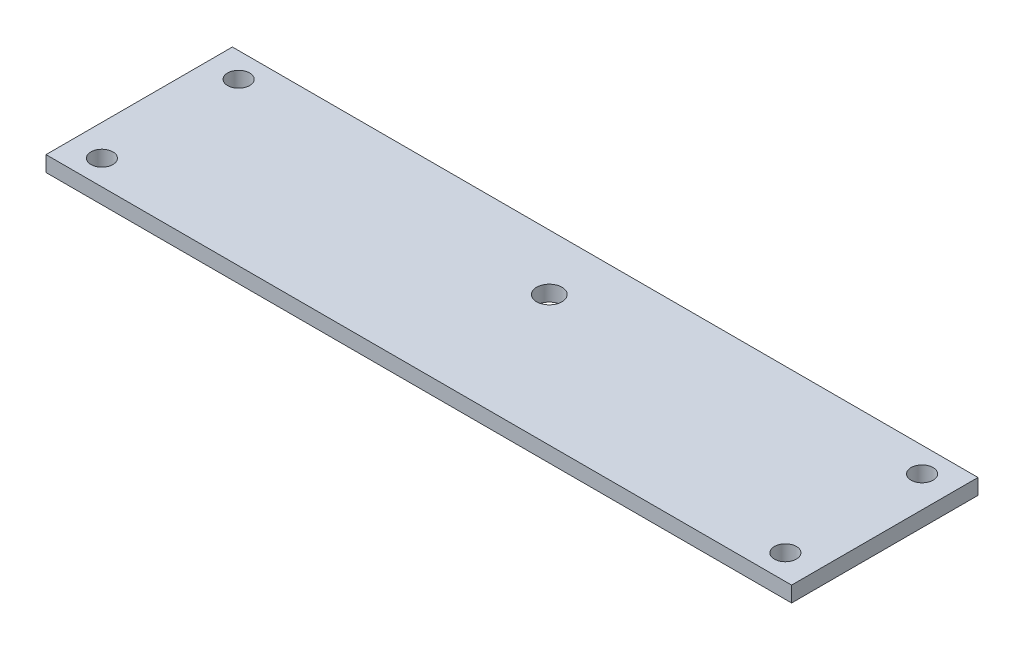
ISO-10303-21;
HEADER;
FILE_DESCRIPTION(('STEP AP214'),'2;1');
FILE_NAME('part.step','',(''),(''),'','','');
FILE_SCHEMA(('AUTOMOTIVE_DESIGN { 1 0 10303 214 1 1 1 1 }'));
ENDSEC;
DATA;
#1=APPLICATION_CONTEXT('core data for automotive mechanical design processes');
#2=APPLICATION_PROTOCOL_DEFINITION('international standard','automotive_design',2000,#1);
#3=PRODUCT_CONTEXT('',#1,'mechanical');
#4=PRODUCT('Part','Part','',(#3));
#5=PRODUCT_RELATED_PRODUCT_CATEGORY('part','',(#4));
#6=PRODUCT_DEFINITION_FORMATION('','',#4);
#7=PRODUCT_DEFINITION_CONTEXT('part definition',#1,'design');
#8=PRODUCT_DEFINITION('design','',#6,#7);
#9=PRODUCT_DEFINITION_SHAPE('','',#8);
#10=(LENGTH_UNIT() NAMED_UNIT(*) SI_UNIT(.MILLI.,.METRE.));
#11=(NAMED_UNIT(*) PLANE_ANGLE_UNIT() SI_UNIT($,.RADIAN.));
#12=(NAMED_UNIT(*) SI_UNIT($,.STERADIAN.) SOLID_ANGLE_UNIT());
#13=UNCERTAINTY_MEASURE_WITH_UNIT(LENGTH_MEASURE(1.E-05),#10,'distance_accuracy_value','');
#14=(GEOMETRIC_REPRESENTATION_CONTEXT(3) GLOBAL_UNCERTAINTY_ASSIGNED_CONTEXT((#13)) GLOBAL_UNIT_ASSIGNED_CONTEXT((#10,
#11,#12)) REPRESENTATION_CONTEXT('',''));
#15=CARTESIAN_POINT('',(0.,0.,0.));
#16=DIRECTION('',(0.,0.,1.));
#17=DIRECTION('',(1.,0.,0.));
#18=AXIS2_PLACEMENT_3D('',#15,#16,#17);
#19=CARTESIAN_POINT('',(76.2,1.5875,19.05));
#20=DIRECTION('',(0.,-1.,0.));
#21=DIRECTION('',(0.,0.,-1.));
#22=AXIS2_PLACEMENT_3D('',#19,#20,#21);
#23=PLANE('',#22);
#24=CARTESIAN_POINT('',(0.,1.5875,-7.62));
#25=DIRECTION('',(0.,1.,0.));
#26=DIRECTION('',(0.,0.,1.));
#27=AXIS2_PLACEMENT_3D('',#24,#25,#26);
#28=CIRCLE('',#27,2.5908);
#29=CARTESIAN_POINT('',(0.,1.5875,-5.0292));
#30=VERTEX_POINT('',#29);
#31=EDGE_CURVE('E202',#30,#30,#28,.T.);
#32=ORIENTED_EDGE('',*,*,#31,.F.);
#33=EDGE_LOOP('',(#32));
#34=FACE_BOUND('',#33,.T.);
#35=CARTESIAN_POINT('',(69.85,1.5875,13.97));
#36=DIRECTION('',(0.,1.,0.));
#37=DIRECTION('',(0.,0.,1.));
#38=AXIS2_PLACEMENT_3D('',#35,#36,#37);
#39=CIRCLE('',#38,2.2479);
#40=CARTESIAN_POINT('',(69.85,1.5875,16.2179));
#41=VERTEX_POINT('',#40);
#42=EDGE_CURVE('E190',#41,#41,#39,.T.);
#43=ORIENTED_EDGE('',*,*,#42,.F.);
#44=EDGE_LOOP('',(#43));
#45=FACE_BOUND('',#44,.T.);
#46=CARTESIAN_POINT('',(-69.85,1.5875,-13.97));
#47=DIRECTION('',(0.,1.,0.));
#48=DIRECTION('',(0.,0.,1.));
#49=AXIS2_PLACEMENT_3D('',#46,#47,#48);
#50=CIRCLE('',#49,2.2479);
#51=CARTESIAN_POINT('',(-69.85,1.5875,-11.7221));
#52=VERTEX_POINT('',#51);
#53=EDGE_CURVE('E182',#52,#52,#50,.T.);
#54=ORIENTED_EDGE('',*,*,#53,.F.);
#55=EDGE_LOOP('',(#54));
#56=FACE_BOUND('',#55,.T.);
#57=CARTESIAN_POINT('',(-69.85,1.5875,13.97));
#58=DIRECTION('',(0.,1.,0.));
#59=DIRECTION('',(0.,0.,1.));
#60=AXIS2_PLACEMENT_3D('',#57,#58,#59);
#61=CIRCLE('',#60,2.2479);
#62=CARTESIAN_POINT('',(-69.85,1.5875,16.2179));
#63=VERTEX_POINT('',#62);
#64=EDGE_CURVE('E106',#63,#63,#61,.T.);
#65=ORIENTED_EDGE('',*,*,#64,.F.);
#66=EDGE_LOOP('',(#65));
#67=FACE_BOUND('',#66,.T.);
#68=DIRECTION('',(0.,0.,-1.));
#69=VECTOR('',#68,1.);
#70=CARTESIAN_POINT('',(76.2,1.5875,19.05));
#71=LINE('',#70,#69);
#72=CARTESIAN_POINT('',(76.2,1.5875,19.05));
#73=VERTEX_POINT('',#72);
#74=CARTESIAN_POINT('',(76.2,1.5875,-19.05));
#75=VERTEX_POINT('',#74);
#76=EDGE_CURVE('E126',#73,#75,#71,.T.);
#77=ORIENTED_EDGE('',*,*,#76,.T.);
#78=DIRECTION('',(-1.,0.,0.));
#79=VECTOR('',#78,1.);
#80=CARTESIAN_POINT('',(76.2,1.5875,-19.05));
#81=LINE('',#80,#79);
#82=CARTESIAN_POINT('',(-76.2,1.5875,-19.05));
#83=VERTEX_POINT('',#82);
#84=EDGE_CURVE('E112',#75,#83,#81,.T.);
#85=ORIENTED_EDGE('',*,*,#84,.T.);
#86=DIRECTION('',(0.,0.,-1.));
#87=VECTOR('',#86,1.);
#88=CARTESIAN_POINT('',(-76.2,1.5875,19.05));
#89=LINE('',#88,#87);
#90=CARTESIAN_POINT('',(-76.2,1.5875,19.05));
#91=VERTEX_POINT('',#90);
#92=EDGE_CURVE('E100',#91,#83,#89,.T.);
#93=ORIENTED_EDGE('',*,*,#92,.F.);
#94=DIRECTION('',(-1.,0.,0.));
#95=VECTOR('',#94,1.);
#96=CARTESIAN_POINT('',(76.2,1.5875,19.05));
#97=LINE('',#96,#95);
#98=EDGE_CURVE('E56',#73,#91,#97,.T.);
#99=ORIENTED_EDGE('',*,*,#98,.F.);
#100=EDGE_LOOP('',(#77,#85,#93,#99));
#101=FACE_BOUND('',#100,.T.);
#102=CARTESIAN_POINT('',(69.85,1.5875,-13.97));
#103=DIRECTION('',(0.,1.,0.));
#104=DIRECTION('',(0.,0.,1.));
#105=AXIS2_PLACEMENT_3D('',#102,#103,#104);
#106=CIRCLE('',#105,2.2479);
#107=CARTESIAN_POINT('',(69.85,1.5875,-11.7221));
#108=VERTEX_POINT('',#107);
#109=EDGE_CURVE('E196',#108,#108,#106,.T.);
#110=ORIENTED_EDGE('',*,*,#109,.F.);
#111=EDGE_LOOP('',(#110));
#112=FACE_BOUND('',#111,.T.);
#113=ADVANCED_FACE('F40',(#34,#45,#56,#67,#101,#112),#23,.F.);
#114=CARTESIAN_POINT('',(-76.2,1.5875,19.05));
#115=DIRECTION('',(1.,0.,0.));
#116=DIRECTION('',(0.,0.,-1.));
#117=AXIS2_PLACEMENT_3D('',#114,#115,#116);
#118=PLANE('',#117);
#119=ORIENTED_EDGE('',*,*,#92,.T.);
#120=DIRECTION('',(0.,-1.,0.));
#121=VECTOR('',#120,1.);
#122=CARTESIAN_POINT('',(-76.2,1.5875,-19.05));
#123=LINE('',#122,#121);
#124=CARTESIAN_POINT('',(-76.2,-1.5875,-19.05));
#125=VERTEX_POINT('',#124);
#126=EDGE_CURVE('E94',#83,#125,#123,.T.);
#127=ORIENTED_EDGE('',*,*,#126,.T.);
#128=DIRECTION('',(0.,0.,-1.));
#129=VECTOR('',#128,1.);
#130=CARTESIAN_POINT('',(-76.2,-1.5875,19.05));
#131=LINE('',#130,#129);
#132=CARTESIAN_POINT('',(-76.2,-1.5875,19.05));
#133=VERTEX_POINT('',#132);
#134=EDGE_CURVE('E11',#133,#125,#131,.T.);
#135=ORIENTED_EDGE('',*,*,#134,.F.);
#136=DIRECTION('',(0.,-1.,0.));
#137=VECTOR('',#136,1.);
#138=CARTESIAN_POINT('',(-76.2,1.5875,19.05));
#139=LINE('',#138,#137);
#140=EDGE_CURVE('E115',#91,#133,#139,.T.);
#141=ORIENTED_EDGE('',*,*,#140,.F.);
#142=EDGE_LOOP('',(#119,#127,#135,#141));
#143=FACE_BOUND('',#142,.T.);
#144=ADVANCED_FACE('F42',(#143),#118,.F.);
#145=CARTESIAN_POINT('',(76.2,-1.5875,19.05));
#146=DIRECTION('',(0.,1.,0.));
#147=DIRECTION('',(0.,0.,1.));
#148=AXIS2_PLACEMENT_3D('',#145,#146,#147);
#149=PLANE('',#148);
#150=CARTESIAN_POINT('',(0.,-1.5875,-7.62));
#151=DIRECTION('',(0.,1.,0.));
#152=DIRECTION('',(0.,0.,1.));
#153=AXIS2_PLACEMENT_3D('',#150,#151,#152);
#154=CIRCLE('',#153,2.5908);
#155=CARTESIAN_POINT('',(0.,-1.5875,-5.0292));
#156=VERTEX_POINT('',#155);
#157=EDGE_CURVE('E158',#156,#156,#154,.T.);
#158=ORIENTED_EDGE('',*,*,#157,.T.);
#159=EDGE_LOOP('',(#158));
#160=FACE_BOUND('',#159,.T.);
#161=CARTESIAN_POINT('',(69.85,-1.5875,-13.97));
#162=DIRECTION('',(0.,1.,0.));
#163=DIRECTION('',(0.,0.,1.));
#164=AXIS2_PLACEMENT_3D('',#161,#162,#163);
#165=CIRCLE('',#164,2.2479);
#166=CARTESIAN_POINT('',(69.85,-1.5875,-11.7221));
#167=VERTEX_POINT('',#166);
#168=EDGE_CURVE('E162',#167,#167,#165,.T.);
#169=ORIENTED_EDGE('',*,*,#168,.T.);
#170=EDGE_LOOP('',(#169));
#171=FACE_BOUND('',#170,.T.);
#172=CARTESIAN_POINT('',(69.85,-1.5875,13.97));
#173=DIRECTION('',(0.,1.,0.));
#174=DIRECTION('',(0.,0.,1.));
#175=AXIS2_PLACEMENT_3D('',#172,#173,#174);
#176=CIRCLE('',#175,2.2479);
#177=CARTESIAN_POINT('',(69.85,-1.5875,16.2179));
#178=VERTEX_POINT('',#177);
#179=EDGE_CURVE('E166',#178,#178,#176,.T.);
#180=ORIENTED_EDGE('',*,*,#179,.T.);
#181=EDGE_LOOP('',(#180));
#182=FACE_BOUND('',#181,.T.);
#183=CARTESIAN_POINT('',(-69.85,-1.5875,-13.97));
#184=DIRECTION('',(0.,1.,0.));
#185=DIRECTION('',(0.,0.,1.));
#186=AXIS2_PLACEMENT_3D('',#183,#184,#185);
#187=CIRCLE('',#186,2.2479);
#188=CARTESIAN_POINT('',(-69.85,-1.5875,-11.7221));
#189=VERTEX_POINT('',#188);
#190=EDGE_CURVE('E170',#189,#189,#187,.T.);
#191=ORIENTED_EDGE('',*,*,#190,.T.);
#192=EDGE_LOOP('',(#191));
#193=FACE_BOUND('',#192,.T.);
#194=CARTESIAN_POINT('',(-69.85,-1.5875,13.97));
#195=DIRECTION('',(0.,1.,0.));
#196=DIRECTION('',(0.,0.,1.));
#197=AXIS2_PLACEMENT_3D('',#194,#195,#196);
#198=CIRCLE('',#197,2.2479);
#199=CARTESIAN_POINT('',(-69.85,-1.5875,16.2179));
#200=VERTEX_POINT('',#199);
#201=EDGE_CURVE('E102',#200,#200,#198,.T.);
#202=ORIENTED_EDGE('',*,*,#201,.T.);
#203=EDGE_LOOP('',(#202));
#204=FACE_BOUND('',#203,.T.);
#205=ORIENTED_EDGE('',*,*,#134,.T.);
#206=DIRECTION('',(1.,0.,0.));
#207=VECTOR('',#206,1.);
#208=CARTESIAN_POINT('',(76.2,-1.5875,-19.05));
#209=LINE('',#208,#207);
#210=CARTESIAN_POINT('',(76.2,-1.5875,-19.05));
#211=VERTEX_POINT('',#210);
#212=EDGE_CURVE('E84',#125,#211,#209,.T.);
#213=ORIENTED_EDGE('',*,*,#212,.T.);
#214=DIRECTION('',(0.,0.,-1.));
#215=VECTOR('',#214,1.);
#216=CARTESIAN_POINT('',(76.2,-1.5875,19.05));
#217=LINE('',#216,#215);
#218=CARTESIAN_POINT('',(76.2,-1.5875,19.05));
#219=VERTEX_POINT('',#218);
#220=EDGE_CURVE('E49',#219,#211,#217,.T.);
#221=ORIENTED_EDGE('',*,*,#220,.F.);
#222=DIRECTION('',(1.,0.,0.));
#223=VECTOR('',#222,1.);
#224=CARTESIAN_POINT('',(76.2,-1.5875,19.05));
#225=LINE('',#224,#223);
#226=EDGE_CURVE('E85',#133,#219,#225,.T.);
#227=ORIENTED_EDGE('',*,*,#226,.F.);
#228=EDGE_LOOP('',(#205,#213,#221,#227));
#229=FACE_BOUND('',#228,.T.);
#230=ADVANCED_FACE('F82',(#160,#171,#182,#193,#204,#229),#149,.F.);
#231=CARTESIAN_POINT('',(76.2,1.5875,19.05));
#232=DIRECTION('',(-1.,0.,0.));
#233=DIRECTION('',(0.,0.,1.));
#234=AXIS2_PLACEMENT_3D('',#231,#232,#233);
#235=PLANE('',#234);
#236=ORIENTED_EDGE('',*,*,#220,.T.);
#237=DIRECTION('',(0.,1.,0.));
#238=VECTOR('',#237,1.);
#239=CARTESIAN_POINT('',(76.2,1.5875,-19.05));
#240=LINE('',#239,#238);
#241=EDGE_CURVE('E97',#211,#75,#240,.T.);
#242=ORIENTED_EDGE('',*,*,#241,.T.);
#243=ORIENTED_EDGE('',*,*,#76,.F.);
#244=DIRECTION('',(0.,1.,0.));
#245=VECTOR('',#244,1.);
#246=CARTESIAN_POINT('',(76.2,1.5875,19.05));
#247=LINE('',#246,#245);
#248=EDGE_CURVE('E61',#219,#73,#247,.T.);
#249=ORIENTED_EDGE('',*,*,#248,.F.);
#250=EDGE_LOOP('',(#236,#242,#243,#249));
#251=FACE_BOUND('',#250,.T.);
#252=ADVANCED_FACE('F130',(#251),#235,.F.);
#253=CARTESIAN_POINT('',(0.,0.,19.05));
#254=DIRECTION('',(0.,0.,-1.));
#255=DIRECTION('',(-1.,0.,0.));
#256=AXIS2_PLACEMENT_3D('',#253,#254,#255);
#257=PLANE('',#256);
#258=ORIENTED_EDGE('',*,*,#140,.T.);
#259=ORIENTED_EDGE('',*,*,#226,.T.);
#260=ORIENTED_EDGE('',*,*,#248,.T.);
#261=ORIENTED_EDGE('',*,*,#98,.T.);
#262=EDGE_LOOP('',(#258,#259,#260,#261));
#263=FACE_BOUND('',#262,.T.);
#264=ADVANCED_FACE('F133',(#263),#257,.F.);
#265=CARTESIAN_POINT('',(0.,0.,-19.05));
#266=DIRECTION('',(0.,0.,-1.));
#267=DIRECTION('',(-1.,0.,0.));
#268=AXIS2_PLACEMENT_3D('',#265,#266,#267);
#269=PLANE('',#268);
#270=ORIENTED_EDGE('',*,*,#126,.F.);
#271=ORIENTED_EDGE('',*,*,#84,.F.);
#272=ORIENTED_EDGE('',*,*,#241,.F.);
#273=ORIENTED_EDGE('',*,*,#212,.F.);
#274=EDGE_LOOP('',(#270,#271,#272,#273));
#275=FACE_BOUND('',#274,.T.);
#276=ADVANCED_FACE('F92',(#275),#269,.T.);
#277=CARTESIAN_POINT('',(-69.85,1.5875,13.97));
#278=DIRECTION('',(0.,1.,0.));
#279=DIRECTION('',(0.,0.,1.));
#280=AXIS2_PLACEMENT_3D('',#277,#278,#279);
#281=CYLINDRICAL_SURFACE('',#280,2.2479);
#282=ORIENTED_EDGE('',*,*,#201,.F.);
#283=EDGE_LOOP('',(#282));
#284=FACE_BOUND('',#283,.T.);
#285=ORIENTED_EDGE('',*,*,#64,.T.);
#286=EDGE_LOOP('',(#285));
#287=FACE_BOUND('',#286,.T.);
#288=ADVANCED_FACE('F140',(#284,#287),#281,.F.);
#289=CARTESIAN_POINT('',(-69.85,1.5875,-13.97));
#290=DIRECTION('',(0.,1.,0.));
#291=DIRECTION('',(0.,0.,1.));
#292=AXIS2_PLACEMENT_3D('',#289,#290,#291);
#293=CYLINDRICAL_SURFACE('',#292,2.2479);
#294=ORIENTED_EDGE('',*,*,#190,.F.);
#295=EDGE_LOOP('',(#294));
#296=FACE_BOUND('',#295,.T.);
#297=ORIENTED_EDGE('',*,*,#53,.T.);
#298=EDGE_LOOP('',(#297));
#299=FACE_BOUND('',#298,.T.);
#300=ADVANCED_FACE('F175',(#296,#299),#293,.F.);
#301=CARTESIAN_POINT('',(69.85,1.5875,13.97));
#302=DIRECTION('',(0.,1.,0.));
#303=DIRECTION('',(0.,0.,1.));
#304=AXIS2_PLACEMENT_3D('',#301,#302,#303);
#305=CYLINDRICAL_SURFACE('',#304,2.2479);
#306=ORIENTED_EDGE('',*,*,#179,.F.);
#307=EDGE_LOOP('',(#306));
#308=FACE_BOUND('',#307,.T.);
#309=ORIENTED_EDGE('',*,*,#42,.T.);
#310=EDGE_LOOP('',(#309));
#311=FACE_BOUND('',#310,.T.);
#312=ADVANCED_FACE('F214',(#308,#311),#305,.F.);
#313=CARTESIAN_POINT('',(69.85,1.5875,-13.97));
#314=DIRECTION('',(0.,1.,0.));
#315=DIRECTION('',(0.,0.,1.));
#316=AXIS2_PLACEMENT_3D('',#313,#314,#315);
#317=CYLINDRICAL_SURFACE('',#316,2.2479);
#318=ORIENTED_EDGE('',*,*,#168,.F.);
#319=EDGE_LOOP('',(#318));
#320=FACE_BOUND('',#319,.T.);
#321=ORIENTED_EDGE('',*,*,#109,.T.);
#322=EDGE_LOOP('',(#321));
#323=FACE_BOUND('',#322,.T.);
#324=ADVANCED_FACE('F208',(#320,#323),#317,.F.);
#325=CARTESIAN_POINT('',(0.,1.5875,-7.62));
#326=DIRECTION('',(0.,1.,0.));
#327=DIRECTION('',(0.,0.,1.));
#328=AXIS2_PLACEMENT_3D('',#325,#326,#327);
#329=CYLINDRICAL_SURFACE('',#328,2.5908);
#330=ORIENTED_EDGE('',*,*,#157,.F.);
#331=EDGE_LOOP('',(#330));
#332=FACE_BOUND('',#331,.T.);
#333=ORIENTED_EDGE('',*,*,#31,.T.);
#334=EDGE_LOOP('',(#333));
#335=FACE_BOUND('',#334,.T.);
#336=ADVANCED_FACE('F206',(#332,#335),#329,.F.);
#337=CLOSED_SHELL('',(#113,#144,#230,#252,#264,#276,#288,#300,#312,#324,#336));
#338=MANIFOLD_SOLID_BREP('B2',#337);
#339=ADVANCED_BREP_SHAPE_REPRESENTATION('',(#18,#338),#14);
#340=SHAPE_DEFINITION_REPRESENTATION(#9,#339);
ENDSEC;
END-ISO-10303-21;
